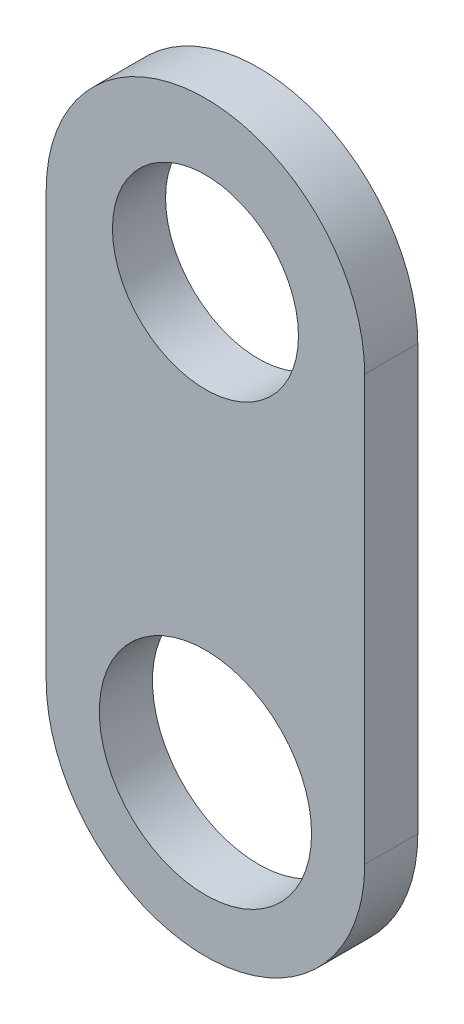
ISO-10303-21;
HEADER;
FILE_DESCRIPTION(('STEP AP214'),'2;1');
FILE_NAME('part.step','',(''),(''),'','','');
FILE_SCHEMA(('AUTOMOTIVE_DESIGN { 1 0 10303 214 1 1 1 1 }'));
ENDSEC;
DATA;
#1=APPLICATION_CONTEXT('core data for automotive mechanical design processes');
#2=APPLICATION_PROTOCOL_DEFINITION('international standard','automotive_design',2000,#1);
#3=PRODUCT_CONTEXT('',#1,'mechanical');
#4=PRODUCT('Part','Part','',(#3));
#5=PRODUCT_RELATED_PRODUCT_CATEGORY('part','',(#4));
#6=PRODUCT_DEFINITION_FORMATION('','',#4);
#7=PRODUCT_DEFINITION_CONTEXT('part definition',#1,'design');
#8=PRODUCT_DEFINITION('design','',#6,#7);
#9=PRODUCT_DEFINITION_SHAPE('','',#8);
#10=(LENGTH_UNIT() NAMED_UNIT(*) SI_UNIT(.MILLI.,.METRE.));
#11=(NAMED_UNIT(*) PLANE_ANGLE_UNIT() SI_UNIT($,.RADIAN.));
#12=(NAMED_UNIT(*) SI_UNIT($,.STERADIAN.) SOLID_ANGLE_UNIT());
#13=UNCERTAINTY_MEASURE_WITH_UNIT(LENGTH_MEASURE(1.E-05),#10,'distance_accuracy_value','');
#14=(GEOMETRIC_REPRESENTATION_CONTEXT(3) GLOBAL_UNCERTAINTY_ASSIGNED_CONTEXT((#13)) GLOBAL_UNIT_ASSIGNED_CONTEXT((#10,
#11,#12)) REPRESENTATION_CONTEXT('',''));
#15=CARTESIAN_POINT('',(0.,0.,0.));
#16=DIRECTION('',(0.,0.,1.));
#17=DIRECTION('',(1.,0.,0.));
#18=AXIS2_PLACEMENT_3D('',#15,#16,#17);
#19=CARTESIAN_POINT('',(0.,0.,3.175));
#20=DIRECTION('',(0.,0.,1.));
#21=DIRECTION('',(1.,0.,0.));
#22=AXIS2_PLACEMENT_3D('',#19,#20,#21);
#23=PLANE('',#22);
#24=CARTESIAN_POINT('',(0.,50.8,3.175));
#25=DIRECTION('',(0.,0.,1.));
#26=DIRECTION('',(1.,0.,0.));
#27=AXIS2_PLACEMENT_3D('',#24,#25,#26);
#28=CIRCLE('',#27,11.1252);
#29=CARTESIAN_POINT('',(11.1252,50.8,3.175));
#30=VERTEX_POINT('',#29);
#31=EDGE_CURVE('E109',#30,#30,#28,.T.);
#32=ORIENTED_EDGE('',*,*,#31,.F.);
#33=EDGE_LOOP('',(#32));
#34=FACE_BOUND('',#33,.T.);
#35=CARTESIAN_POINT('',(0.,0.,3.175));
#36=DIRECTION('',(0.,0.,1.));
#37=DIRECTION('',(1.,0.,0.));
#38=AXIS2_PLACEMENT_3D('',#35,#36,#37);
#39=CIRCLE('',#38,19.05);
#40=CARTESIAN_POINT('',(-19.05,0.,3.175));
#41=VERTEX_POINT('',#40);
#42=CARTESIAN_POINT('',(19.05,0.,3.175));
#43=VERTEX_POINT('',#42);
#44=EDGE_CURVE('E92',#41,#43,#39,.T.);
#45=ORIENTED_EDGE('',*,*,#44,.T.);
#46=DIRECTION('',(0.,1.,0.));
#47=VECTOR('',#46,1.);
#48=CARTESIAN_POINT('',(19.05,0.,3.175));
#49=LINE('',#48,#47);
#50=CARTESIAN_POINT('',(19.05,50.8,3.175));
#51=VERTEX_POINT('',#50);
#52=EDGE_CURVE('E89',#43,#51,#49,.T.);
#53=ORIENTED_EDGE('',*,*,#52,.T.);
#54=CARTESIAN_POINT('',(0.,50.8,3.175));
#55=DIRECTION('',(0.,0.,1.));
#56=DIRECTION('',(1.,0.,0.));
#57=AXIS2_PLACEMENT_3D('',#54,#55,#56);
#58=CIRCLE('',#57,19.05);
#59=CARTESIAN_POINT('',(-19.05,50.8,3.175));
#60=VERTEX_POINT('',#59);
#61=EDGE_CURVE('E91',#51,#60,#58,.T.);
#62=ORIENTED_EDGE('',*,*,#61,.T.);
#63=DIRECTION('',(0.,-1.,0.));
#64=VECTOR('',#63,1.);
#65=CARTESIAN_POINT('',(-19.05,0.,3.175));
#66=LINE('',#65,#64);
#67=EDGE_CURVE('E58',#60,#41,#66,.T.);
#68=ORIENTED_EDGE('',*,*,#67,.T.);
#69=EDGE_LOOP('',(#45,#53,#62,#68));
#70=FACE_BOUND('',#69,.T.);
#71=CARTESIAN_POINT('',(0.,0.,3.175));
#72=DIRECTION('',(0.,0.,1.));
#73=DIRECTION('',(1.,0.,0.));
#74=AXIS2_PLACEMENT_3D('',#71,#72,#73);
#75=CIRCLE('',#74,12.69365);
#76=CARTESIAN_POINT('',(12.69365,0.,3.175));
#77=VERTEX_POINT('',#76);
#78=EDGE_CURVE('E121',#77,#77,#75,.T.);
#79=ORIENTED_EDGE('',*,*,#78,.F.);
#80=EDGE_LOOP('',(#79));
#81=FACE_BOUND('',#80,.T.);
#82=ADVANCED_FACE('F43',(#34,#70,#81),#23,.T.);
#83=CARTESIAN_POINT('',(0.,0.,-3.175));
#84=DIRECTION('',(0.,0.,1.));
#85=DIRECTION('',(1.,0.,0.));
#86=AXIS2_PLACEMENT_3D('',#83,#84,#85);
#87=PLANE('',#86);
#88=CARTESIAN_POINT('',(0.,0.,-3.175));
#89=DIRECTION('',(0.,0.,1.));
#90=DIRECTION('',(1.,0.,0.));
#91=AXIS2_PLACEMENT_3D('',#88,#89,#90);
#92=CIRCLE('',#91,19.05);
#93=CARTESIAN_POINT('',(-19.05,0.,-3.175));
#94=VERTEX_POINT('',#93);
#95=CARTESIAN_POINT('',(19.05,0.,-3.175));
#96=VERTEX_POINT('',#95);
#97=EDGE_CURVE('E110',#94,#96,#92,.T.);
#98=ORIENTED_EDGE('',*,*,#97,.F.);
#99=DIRECTION('',(0.,-1.,0.));
#100=VECTOR('',#99,1.);
#101=CARTESIAN_POINT('',(-19.05,0.,-3.175));
#102=LINE('',#101,#100);
#103=CARTESIAN_POINT('',(-19.05,50.8,-3.175));
#104=VERTEX_POINT('',#103);
#105=EDGE_CURVE('E83',#104,#94,#102,.T.);
#106=ORIENTED_EDGE('',*,*,#105,.F.);
#107=CARTESIAN_POINT('',(0.,50.8,-3.175));
#108=DIRECTION('',(0.,0.,1.));
#109=DIRECTION('',(1.,0.,0.));
#110=AXIS2_PLACEMENT_3D('',#107,#108,#109);
#111=CIRCLE('',#110,19.05);
#112=CARTESIAN_POINT('',(19.05,50.8,-3.175));
#113=VERTEX_POINT('',#112);
#114=EDGE_CURVE('E80',#113,#104,#111,.T.);
#115=ORIENTED_EDGE('',*,*,#114,.F.);
#116=DIRECTION('',(0.,1.,0.));
#117=VECTOR('',#116,1.);
#118=CARTESIAN_POINT('',(19.05,0.,-3.175));
#119=LINE('',#118,#117);
#120=EDGE_CURVE('E97',#96,#113,#119,.T.);
#121=ORIENTED_EDGE('',*,*,#120,.F.);
#122=EDGE_LOOP('',(#98,#106,#115,#121));
#123=FACE_BOUND('',#122,.T.);
#124=CARTESIAN_POINT('',(0.,50.8,-3.175));
#125=DIRECTION('',(0.,0.,1.));
#126=DIRECTION('',(1.,0.,0.));
#127=AXIS2_PLACEMENT_3D('',#124,#125,#126);
#128=CIRCLE('',#127,11.1252);
#129=CARTESIAN_POINT('',(11.1252,50.8,-3.175));
#130=VERTEX_POINT('',#129);
#131=EDGE_CURVE('E125',#130,#130,#128,.T.);
#132=ORIENTED_EDGE('',*,*,#131,.T.);
#133=EDGE_LOOP('',(#132));
#134=FACE_BOUND('',#133,.T.);
#135=CARTESIAN_POINT('',(0.,0.,-3.175));
#136=DIRECTION('',(0.,0.,1.));
#137=DIRECTION('',(1.,0.,0.));
#138=AXIS2_PLACEMENT_3D('',#135,#136,#137);
#139=CIRCLE('',#138,12.69365);
#140=CARTESIAN_POINT('',(12.69365,0.,-3.175));
#141=VERTEX_POINT('',#140);
#142=EDGE_CURVE('E126',#141,#141,#139,.T.);
#143=ORIENTED_EDGE('',*,*,#142,.T.);
#144=EDGE_LOOP('',(#143));
#145=FACE_BOUND('',#144,.T.);
#146=ADVANCED_FACE('F119',(#123,#134,#145),#87,.F.);
#147=CARTESIAN_POINT('',(0.,0.,3.175));
#148=DIRECTION('',(0.,0.,-1.));
#149=DIRECTION('',(-1.,0.,0.));
#150=AXIS2_PLACEMENT_3D('',#147,#148,#149);
#151=CYLINDRICAL_SURFACE('',#150,19.05);
#152=ORIENTED_EDGE('',*,*,#97,.T.);
#153=DIRECTION('',(0.,0.,-1.));
#154=VECTOR('',#153,1.);
#155=CARTESIAN_POINT('',(19.05,0.,3.175));
#156=LINE('',#155,#154);
#157=EDGE_CURVE('E11',#43,#96,#156,.T.);
#158=ORIENTED_EDGE('',*,*,#157,.F.);
#159=ORIENTED_EDGE('',*,*,#44,.F.);
#160=DIRECTION('',(0.,0.,-1.));
#161=VECTOR('',#160,1.);
#162=CARTESIAN_POINT('',(-19.05,0.,3.175));
#163=LINE('',#162,#161);
#164=EDGE_CURVE('E103',#41,#94,#163,.T.);
#165=ORIENTED_EDGE('',*,*,#164,.T.);
#166=EDGE_LOOP('',(#152,#158,#159,#165));
#167=FACE_BOUND('',#166,.T.);
#168=ADVANCED_FACE('F44',(#167),#151,.T.);
#169=CARTESIAN_POINT('',(19.05,0.,3.175));
#170=DIRECTION('',(-1.,0.,0.));
#171=DIRECTION('',(0.,0.,1.));
#172=AXIS2_PLACEMENT_3D('',#169,#170,#171);
#173=PLANE('',#172);
#174=ORIENTED_EDGE('',*,*,#120,.T.);
#175=DIRECTION('',(0.,0.,-1.));
#176=VECTOR('',#175,1.);
#177=CARTESIAN_POINT('',(19.05,50.8,3.175));
#178=LINE('',#177,#176);
#179=EDGE_CURVE('E55',#51,#113,#178,.T.);
#180=ORIENTED_EDGE('',*,*,#179,.F.);
#181=ORIENTED_EDGE('',*,*,#52,.F.);
#182=ORIENTED_EDGE('',*,*,#157,.T.);
#183=EDGE_LOOP('',(#174,#180,#181,#182));
#184=FACE_BOUND('',#183,.T.);
#185=ADVANCED_FACE('F98',(#184),#173,.F.);
#186=CARTESIAN_POINT('',(0.,50.8,3.175));
#187=DIRECTION('',(0.,0.,-1.));
#188=DIRECTION('',(-1.,0.,0.));
#189=AXIS2_PLACEMENT_3D('',#186,#187,#188);
#190=CYLINDRICAL_SURFACE('',#189,19.05);
#191=ORIENTED_EDGE('',*,*,#114,.T.);
#192=DIRECTION('',(0.,0.,-1.));
#193=VECTOR('',#192,1.);
#194=CARTESIAN_POINT('',(-19.05,50.8,3.175));
#195=LINE('',#194,#193);
#196=EDGE_CURVE('E99',#60,#104,#195,.T.);
#197=ORIENTED_EDGE('',*,*,#196,.F.);
#198=ORIENTED_EDGE('',*,*,#61,.F.);
#199=ORIENTED_EDGE('',*,*,#179,.T.);
#200=EDGE_LOOP('',(#191,#197,#198,#199));
#201=FACE_BOUND('',#200,.T.);
#202=ADVANCED_FACE('F101',(#201),#190,.T.);
#203=CARTESIAN_POINT('',(-19.05,0.,3.175));
#204=DIRECTION('',(1.,0.,0.));
#205=DIRECTION('',(0.,0.,-1.));
#206=AXIS2_PLACEMENT_3D('',#203,#204,#205);
#207=PLANE('',#206);
#208=ORIENTED_EDGE('',*,*,#105,.T.);
#209=ORIENTED_EDGE('',*,*,#164,.F.);
#210=ORIENTED_EDGE('',*,*,#67,.F.);
#211=ORIENTED_EDGE('',*,*,#196,.T.);
#212=EDGE_LOOP('',(#208,#209,#210,#211));
#213=FACE_BOUND('',#212,.T.);
#214=ADVANCED_FACE('F113',(#213),#207,.F.);
#215=CARTESIAN_POINT('',(0.,50.8,3.175));
#216=DIRECTION('',(0.,0.,-1.));
#217=DIRECTION('',(-1.,0.,0.));
#218=AXIS2_PLACEMENT_3D('',#215,#216,#217);
#219=CYLINDRICAL_SURFACE('',#218,11.1252);
#220=ORIENTED_EDGE('',*,*,#31,.T.);
#221=EDGE_LOOP('',(#220));
#222=FACE_BOUND('',#221,.T.);
#223=ORIENTED_EDGE('',*,*,#131,.F.);
#224=EDGE_LOOP('',(#223));
#225=FACE_BOUND('',#224,.T.);
#226=ADVANCED_FACE('F144',(#222,#225),#219,.F.);
#227=CARTESIAN_POINT('',(0.,0.,3.175));
#228=DIRECTION('',(0.,0.,-1.));
#229=DIRECTION('',(-1.,0.,0.));
#230=AXIS2_PLACEMENT_3D('',#227,#228,#229);
#231=CYLINDRICAL_SURFACE('',#230,12.69365);
#232=ORIENTED_EDGE('',*,*,#78,.T.);
#233=EDGE_LOOP('',(#232));
#234=FACE_BOUND('',#233,.T.);
#235=ORIENTED_EDGE('',*,*,#142,.F.);
#236=EDGE_LOOP('',(#235));
#237=FACE_BOUND('',#236,.T.);
#238=ADVANCED_FACE('F131',(#234,#237),#231,.F.);
#239=CLOSED_SHELL('',(#82,#146,#168,#185,#202,#214,#226,#238));
#240=MANIFOLD_SOLID_BREP('B2',#239);
#241=ADVANCED_BREP_SHAPE_REPRESENTATION('',(#18,#240),#14);
#242=SHAPE_DEFINITION_REPRESENTATION(#9,#241);
ENDSEC;
END-ISO-10303-21;
